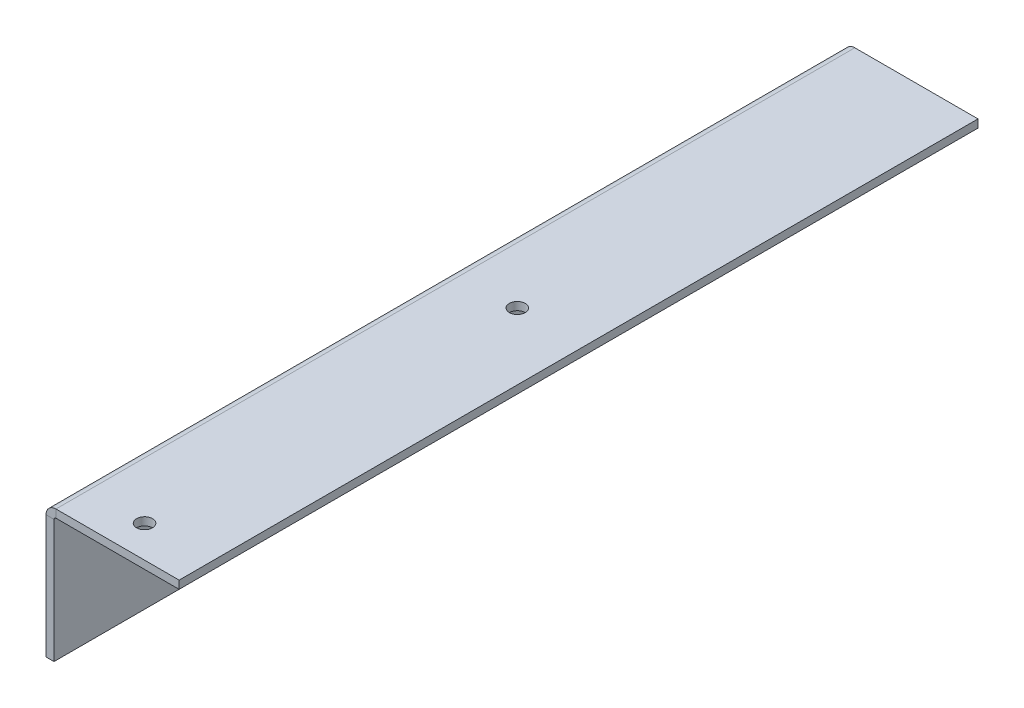
ISO-10303-21;
HEADER;
FILE_DESCRIPTION(('STEP AP214'),'2;1');
FILE_NAME('part.step','',(''),(''),'','','');
FILE_SCHEMA(('AUTOMOTIVE_DESIGN { 1 0 10303 214 1 1 1 1 }'));
ENDSEC;
DATA;
#1=APPLICATION_CONTEXT('core data for automotive mechanical design processes');
#2=APPLICATION_PROTOCOL_DEFINITION('international standard','automotive_design',2000,#1);
#3=PRODUCT_CONTEXT('',#1,'mechanical');
#4=PRODUCT('Part','Part','',(#3));
#5=PRODUCT_RELATED_PRODUCT_CATEGORY('part','',(#4));
#6=PRODUCT_DEFINITION_FORMATION('','',#4);
#7=PRODUCT_DEFINITION_CONTEXT('part definition',#1,'design');
#8=PRODUCT_DEFINITION('design','',#6,#7);
#9=PRODUCT_DEFINITION_SHAPE('','',#8);
#10=(LENGTH_UNIT() NAMED_UNIT(*) SI_UNIT(.MILLI.,.METRE.));
#11=(NAMED_UNIT(*) PLANE_ANGLE_UNIT() SI_UNIT($,.RADIAN.));
#12=(NAMED_UNIT(*) SI_UNIT($,.STERADIAN.) SOLID_ANGLE_UNIT());
#13=UNCERTAINTY_MEASURE_WITH_UNIT(LENGTH_MEASURE(1.E-05),#10,'distance_accuracy_value','');
#14=(GEOMETRIC_REPRESENTATION_CONTEXT(3) GLOBAL_UNCERTAINTY_ASSIGNED_CONTEXT((#13)) GLOBAL_UNIT_ASSIGNED_CONTEXT((#10,
#11,#12)) REPRESENTATION_CONTEXT('',''));
#15=CARTESIAN_POINT('',(0.,0.,0.));
#16=DIRECTION('',(0.,0.,1.));
#17=DIRECTION('',(1.,0.,0.));
#18=AXIS2_PLACEMENT_3D('',#15,#16,#17);
#19=CARTESIAN_POINT('',(3.7366,50.,300.));
#20=DIRECTION('',(0.,0.,1.));
#21=DIRECTION('',(1.,0.,0.));
#22=AXIS2_PLACEMENT_3D('',#19,#20,#21);
#23=PLANE('',#22);
#24=DIRECTION('',(0.,-1.,0.));
#25=VECTOR('',#24,1.);
#26=CARTESIAN_POINT('',(3.7366,50.,300.));
#27=LINE('',#26,#25);
#28=CARTESIAN_POINT('',(3.7366,50.,300.));
#29=VERTEX_POINT('',#28);
#30=CARTESIAN_POINT('',(3.7366,47.,300.));
#31=VERTEX_POINT('',#30);
#32=EDGE_CURVE('E11',#29,#31,#27,.T.);
#33=ORIENTED_EDGE('',*,*,#32,.F.);
#34=CARTESIAN_POINT('',(3.7366,46.2634,300.));
#35=DIRECTION('',(0.,0.,1.));
#36=DIRECTION('',(1.,0.,0.));
#37=AXIS2_PLACEMENT_3D('',#34,#35,#36);
#38=CIRCLE('',#37,3.7366);
#39=CARTESIAN_POINT('',(0.,46.2634,300.));
#40=VERTEX_POINT('',#39);
#41=EDGE_CURVE('E138',#40,#29,#38,.F.);
#42=ORIENTED_EDGE('',*,*,#41,.F.);
#43=DIRECTION('',(-1.,0.,0.));
#44=VECTOR('',#43,1.);
#45=CARTESIAN_POINT('',(3.,46.2634,300.));
#46=LINE('',#45,#44);
#47=CARTESIAN_POINT('',(3.,46.2634,300.));
#48=VERTEX_POINT('',#47);
#49=EDGE_CURVE('E49',#48,#40,#46,.T.);
#50=ORIENTED_EDGE('',*,*,#49,.F.);
#51=CARTESIAN_POINT('',(3.7366,46.2634,300.));
#52=DIRECTION('',(0.,0.,1.));
#53=DIRECTION('',(1.,0.,0.));
#54=AXIS2_PLACEMENT_3D('',#51,#52,#53);
#55=CIRCLE('',#54,0.7366);
#56=EDGE_CURVE('E131',#48,#31,#55,.F.);
#57=ORIENTED_EDGE('',*,*,#56,.T.);
#58=EDGE_LOOP('',(#33,#42,#50,#57));
#59=FACE_BOUND('',#58,.T.);
#60=ADVANCED_FACE('F41',(#59),#23,.T.);
#61=CARTESIAN_POINT('',(3.,46.2634,300.));
#62=DIRECTION('',(0.,0.,1.));
#63=DIRECTION('',(1.,0.,0.));
#64=AXIS2_PLACEMENT_3D('',#61,#62,#63);
#65=PLANE('',#64);
#66=DIRECTION('',(1.,0.,0.));
#67=VECTOR('',#66,1.);
#68=CARTESIAN_POINT('',(0.,50.,300.));
#69=LINE('',#68,#67);
#70=CARTESIAN_POINT('',(50.,50.,300.));
#71=VERTEX_POINT('',#70);
#72=EDGE_CURVE('E188',#29,#71,#69,.T.);
#73=ORIENTED_EDGE('',*,*,#72,.F.);
#74=ORIENTED_EDGE('',*,*,#32,.T.);
#75=DIRECTION('',(1.,0.,0.));
#76=VECTOR('',#75,1.);
#77=CARTESIAN_POINT('',(0.,47.,300.));
#78=LINE('',#77,#76);
#79=CARTESIAN_POINT('',(50.,47.,300.));
#80=VERTEX_POINT('',#79);
#81=EDGE_CURVE('E97',#31,#80,#78,.T.);
#82=ORIENTED_EDGE('',*,*,#81,.T.);
#83=DIRECTION('',(0.,-1.,0.));
#84=VECTOR('',#83,1.);
#85=CARTESIAN_POINT('',(50.,50.,300.));
#86=LINE('',#85,#84);
#87=EDGE_CURVE('E379',#71,#80,#86,.T.);
#88=ORIENTED_EDGE('',*,*,#87,.F.);
#89=EDGE_LOOP('',(#73,#74,#82,#88));
#90=FACE_BOUND('',#89,.T.);
#91=ADVANCED_FACE('F196',(#90),#65,.T.);
#92=CARTESIAN_POINT('',(0.,46.2634,0.));
#93=DIRECTION('',(0.,0.,-1.));
#94=DIRECTION('',(-1.,0.,0.));
#95=AXIS2_PLACEMENT_3D('',#92,#93,#94);
#96=PLANE('',#95);
#97=DIRECTION('',(1.,0.,0.));
#98=VECTOR('',#97,1.);
#99=CARTESIAN_POINT('',(0.,46.2634,0.));
#100=LINE('',#99,#98);
#101=CARTESIAN_POINT('',(0.,46.2634,0.));
#102=VERTEX_POINT('',#101);
#103=CARTESIAN_POINT('',(3.,46.2634,0.));
#104=VERTEX_POINT('',#103);
#105=EDGE_CURVE('E84',#102,#104,#100,.T.);
#106=ORIENTED_EDGE('',*,*,#105,.F.);
#107=CARTESIAN_POINT('',(3.7366,46.2634,0.));
#108=DIRECTION('',(0.,0.,1.));
#109=DIRECTION('',(1.,0.,0.));
#110=AXIS2_PLACEMENT_3D('',#107,#108,#109);
#111=CIRCLE('',#110,3.7366);
#112=CARTESIAN_POINT('',(3.7366,50.,0.));
#113=VERTEX_POINT('',#112);
#114=EDGE_CURVE('E154',#102,#113,#111,.F.);
#115=ORIENTED_EDGE('',*,*,#114,.T.);
#116=DIRECTION('',(0.,1.,0.));
#117=VECTOR('',#116,1.);
#118=CARTESIAN_POINT('',(3.7366,47.,0.));
#119=LINE('',#118,#117);
#120=CARTESIAN_POINT('',(3.7366,47.,0.));
#121=VERTEX_POINT('',#120);
#122=EDGE_CURVE('E91',#121,#113,#119,.T.);
#123=ORIENTED_EDGE('',*,*,#122,.F.);
#124=CARTESIAN_POINT('',(3.7366,46.2634,0.));
#125=DIRECTION('',(0.,0.,1.));
#126=DIRECTION('',(1.,0.,0.));
#127=AXIS2_PLACEMENT_3D('',#124,#125,#126);
#128=CIRCLE('',#127,0.7366);
#129=EDGE_CURVE('E161',#104,#121,#128,.F.);
#130=ORIENTED_EDGE('',*,*,#129,.F.);
#131=EDGE_LOOP('',(#106,#115,#123,#130));
#132=FACE_BOUND('',#131,.T.);
#133=ADVANCED_FACE('F194',(#132),#96,.T.);
#134=CARTESIAN_POINT('',(3.7366,47.,0.));
#135=DIRECTION('',(0.,0.,-1.));
#136=DIRECTION('',(-1.,0.,0.));
#137=AXIS2_PLACEMENT_3D('',#134,#135,#136);
#138=PLANE('',#137);
#139=DIRECTION('',(0.,1.,0.));
#140=VECTOR('',#139,1.);
#141=CARTESIAN_POINT('',(0.,0.,0.));
#142=LINE('',#141,#140);
#143=CARTESIAN_POINT('',(0.,0.,0.));
#144=VERTEX_POINT('',#143);
#145=EDGE_CURVE('E156',#144,#102,#142,.T.);
#146=ORIENTED_EDGE('',*,*,#145,.T.);
#147=ORIENTED_EDGE('',*,*,#105,.T.);
#148=DIRECTION('',(0.,1.,0.));
#149=VECTOR('',#148,1.);
#150=CARTESIAN_POINT('',(3.,0.,0.));
#151=LINE('',#150,#149);
#152=CARTESIAN_POINT('',(3.,0.,0.));
#153=VERTEX_POINT('',#152);
#154=EDGE_CURVE('E159',#153,#104,#151,.T.);
#155=ORIENTED_EDGE('',*,*,#154,.F.);
#156=DIRECTION('',(-1.,0.,0.));
#157=VECTOR('',#156,1.);
#158=CARTESIAN_POINT('',(3.,0.,0.));
#159=LINE('',#158,#157);
#160=EDGE_CURVE('E119',#153,#144,#159,.T.);
#161=ORIENTED_EDGE('',*,*,#160,.T.);
#162=EDGE_LOOP('',(#146,#147,#155,#161));
#163=FACE_BOUND('',#162,.T.);
#164=ADVANCED_FACE('F190',(#163),#138,.T.);
#165=CARTESIAN_POINT('',(0.,47.,300.));
#166=DIRECTION('',(0.,1.,0.));
#167=DIRECTION('',(0.,0.,1.));
#168=AXIS2_PLACEMENT_3D('',#165,#166,#167);
#169=PLANE('',#168);
#170=CARTESIAN_POINT('',(25.,47.,288.));
#171=DIRECTION('',(0.,1.,0.));
#172=DIRECTION('',(0.,0.,1.));
#173=AXIS2_PLACEMENT_3D('',#170,#171,#172);
#174=CIRCLE('',#173,3.);
#175=CARTESIAN_POINT('',(25.,47.,291.));
#176=VERTEX_POINT('',#175);
#177=EDGE_CURVE('E148',#176,#176,#174,.T.);
#178=ORIENTED_EDGE('',*,*,#177,.T.);
#179=EDGE_LOOP('',(#178));
#180=FACE_BOUND('',#179,.T.);
#181=CARTESIAN_POINT('',(25.,47.,148.));
#182=DIRECTION('',(0.,1.,0.));
#183=DIRECTION('',(0.,0.,1.));
#184=AXIS2_PLACEMENT_3D('',#181,#182,#183);
#185=CIRCLE('',#184,3.);
#186=CARTESIAN_POINT('',(25.,47.,151.));
#187=VERTEX_POINT('',#186);
#188=EDGE_CURVE('E372',#187,#187,#185,.T.);
#189=ORIENTED_EDGE('',*,*,#188,.T.);
#190=EDGE_LOOP('',(#189));
#191=FACE_BOUND('',#190,.T.);
#192=DIRECTION('',(1.,0.,0.));
#193=VECTOR('',#192,1.);
#194=CARTESIAN_POINT('',(0.,47.,0.));
#195=LINE('',#194,#193);
#196=CARTESIAN_POINT('',(50.,47.,0.));
#197=VERTEX_POINT('',#196);
#198=EDGE_CURVE('E144',#121,#197,#195,.T.);
#199=ORIENTED_EDGE('',*,*,#198,.T.);
#200=DIRECTION('',(0.,0.,-1.));
#201=VECTOR('',#200,1.);
#202=CARTESIAN_POINT('',(50.,47.,300.));
#203=LINE('',#202,#201);
#204=EDGE_CURVE('E175',#80,#197,#203,.T.);
#205=ORIENTED_EDGE('',*,*,#204,.F.);
#206=ORIENTED_EDGE('',*,*,#81,.F.);
#207=DIRECTION('',(0.,0.,-1.));
#208=VECTOR('',#207,1.);
#209=CARTESIAN_POINT('',(3.7366,47.,300.));
#210=LINE('',#209,#208);
#211=EDGE_CURVE('E143',#31,#121,#210,.T.);
#212=ORIENTED_EDGE('',*,*,#211,.T.);
#213=EDGE_LOOP('',(#199,#205,#206,#212));
#214=FACE_BOUND('',#213,.T.);
#215=ADVANCED_FACE('F202',(#180,#191,#214),#169,.F.);
#216=CARTESIAN_POINT('',(50.,50.,300.));
#217=DIRECTION('',(1.,0.,0.));
#218=DIRECTION('',(0.,0.,-1.));
#219=AXIS2_PLACEMENT_3D('',#216,#217,#218);
#220=PLANE('',#219);
#221=DIRECTION('',(0.,-1.,0.));
#222=VECTOR('',#221,1.);
#223=CARTESIAN_POINT('',(50.,50.,0.));
#224=LINE('',#223,#222);
#225=CARTESIAN_POINT('',(50.,50.,0.));
#226=VERTEX_POINT('',#225);
#227=EDGE_CURVE('E147',#226,#197,#224,.T.);
#228=ORIENTED_EDGE('',*,*,#227,.F.);
#229=DIRECTION('',(0.,0.,-1.));
#230=VECTOR('',#229,1.);
#231=CARTESIAN_POINT('',(50.,50.,300.));
#232=LINE('',#231,#230);
#233=EDGE_CURVE('E173',#71,#226,#232,.T.);
#234=ORIENTED_EDGE('',*,*,#233,.F.);
#235=ORIENTED_EDGE('',*,*,#87,.T.);
#236=ORIENTED_EDGE('',*,*,#204,.T.);
#237=EDGE_LOOP('',(#228,#234,#235,#236));
#238=FACE_BOUND('',#237,.T.);
#239=ADVANCED_FACE('F231',(#238),#220,.T.);
#240=CARTESIAN_POINT('',(0.,50.,300.));
#241=DIRECTION('',(0.,1.,0.));
#242=DIRECTION('',(0.,0.,1.));
#243=AXIS2_PLACEMENT_3D('',#240,#241,#242);
#244=PLANE('',#243);
#245=CARTESIAN_POINT('',(25.,50.,288.));
#246=DIRECTION('',(0.,1.,0.));
#247=DIRECTION('',(0.,0.,1.));
#248=AXIS2_PLACEMENT_3D('',#245,#246,#247);
#249=CIRCLE('',#248,3.);
#250=CARTESIAN_POINT('',(25.,50.,291.));
#251=VERTEX_POINT('',#250);
#252=EDGE_CURVE('E369',#251,#251,#249,.T.);
#253=ORIENTED_EDGE('',*,*,#252,.F.);
#254=EDGE_LOOP('',(#253));
#255=FACE_BOUND('',#254,.T.);
#256=CARTESIAN_POINT('',(25.,50.,148.));
#257=DIRECTION('',(0.,1.,0.));
#258=DIRECTION('',(0.,0.,1.));
#259=AXIS2_PLACEMENT_3D('',#256,#257,#258);
#260=CIRCLE('',#259,3.);
#261=CARTESIAN_POINT('',(25.,50.,151.));
#262=VERTEX_POINT('',#261);
#263=EDGE_CURVE('E388',#262,#262,#260,.T.);
#264=ORIENTED_EDGE('',*,*,#263,.F.);
#265=EDGE_LOOP('',(#264));
#266=FACE_BOUND('',#265,.T.);
#267=DIRECTION('',(1.,0.,0.));
#268=VECTOR('',#267,1.);
#269=CARTESIAN_POINT('',(0.,50.,0.));
#270=LINE('',#269,#268);
#271=EDGE_CURVE('E151',#113,#226,#270,.T.);
#272=ORIENTED_EDGE('',*,*,#271,.F.);
#273=DIRECTION('',(0.,0.,-1.));
#274=VECTOR('',#273,1.);
#275=CARTESIAN_POINT('',(3.7366,50.,300.));
#276=LINE('',#275,#274);
#277=EDGE_CURVE('E170',#29,#113,#276,.T.);
#278=ORIENTED_EDGE('',*,*,#277,.F.);
#279=ORIENTED_EDGE('',*,*,#72,.T.);
#280=ORIENTED_EDGE('',*,*,#233,.T.);
#281=EDGE_LOOP('',(#272,#278,#279,#280));
#282=FACE_BOUND('',#281,.T.);
#283=ADVANCED_FACE('F236',(#255,#266,#282),#244,.T.);
#284=CARTESIAN_POINT('',(3.7366,46.2634,300.));
#285=DIRECTION('',(0.,0.,-1.));
#286=DIRECTION('',(-1.,0.,0.));
#287=AXIS2_PLACEMENT_3D('',#284,#285,#286);
#288=CYLINDRICAL_SURFACE('',#287,3.7366);
#289=ORIENTED_EDGE('',*,*,#114,.F.);
#290=DIRECTION('',(0.,0.,-1.));
#291=VECTOR('',#290,1.);
#292=CARTESIAN_POINT('',(0.,46.2634,300.));
#293=LINE('',#292,#291);
#294=EDGE_CURVE('E167',#40,#102,#293,.T.);
#295=ORIENTED_EDGE('',*,*,#294,.F.);
#296=ORIENTED_EDGE('',*,*,#41,.T.);
#297=ORIENTED_EDGE('',*,*,#277,.T.);
#298=EDGE_LOOP('',(#289,#295,#296,#297));
#299=FACE_BOUND('',#298,.T.);
#300=ADVANCED_FACE('F184',(#299),#288,.T.);
#301=CARTESIAN_POINT('',(0.,0.,300.));
#302=DIRECTION('',(-1.,0.,0.));
#303=DIRECTION('',(0.,0.,1.));
#304=AXIS2_PLACEMENT_3D('',#301,#302,#303);
#305=PLANE('',#304);
#306=ORIENTED_EDGE('',*,*,#145,.F.);
#307=DIRECTION('',(0.,0.,-1.));
#308=VECTOR('',#307,1.);
#309=CARTESIAN_POINT('',(0.,0.,300.));
#310=LINE('',#309,#308);
#311=CARTESIAN_POINT('',(0.,0.,300.));
#312=VERTEX_POINT('',#311);
#313=EDGE_CURVE('E121',#312,#144,#310,.T.);
#314=ORIENTED_EDGE('',*,*,#313,.F.);
#315=DIRECTION('',(0.,1.,0.));
#316=VECTOR('',#315,1.);
#317=CARTESIAN_POINT('',(0.,0.,300.));
#318=LINE('',#317,#316);
#319=EDGE_CURVE('E136',#312,#40,#318,.T.);
#320=ORIENTED_EDGE('',*,*,#319,.T.);
#321=ORIENTED_EDGE('',*,*,#294,.T.);
#322=EDGE_LOOP('',(#306,#314,#320,#321));
#323=FACE_BOUND('',#322,.T.);
#324=ADVANCED_FACE('F189',(#323),#305,.T.);
#325=CARTESIAN_POINT('',(3.,0.,300.));
#326=DIRECTION('',(0.,-1.,0.));
#327=DIRECTION('',(0.,0.,-1.));
#328=AXIS2_PLACEMENT_3D('',#325,#326,#327);
#329=PLANE('',#328);
#330=ORIENTED_EDGE('',*,*,#160,.F.);
#331=DIRECTION('',(0.,0.,-1.));
#332=VECTOR('',#331,1.);
#333=CARTESIAN_POINT('',(3.,0.,300.));
#334=LINE('',#333,#332);
#335=CARTESIAN_POINT('',(3.,0.,300.));
#336=VERTEX_POINT('',#335);
#337=EDGE_CURVE('E113',#336,#153,#334,.T.);
#338=ORIENTED_EDGE('',*,*,#337,.F.);
#339=DIRECTION('',(-1.,0.,0.));
#340=VECTOR('',#339,1.);
#341=CARTESIAN_POINT('',(3.,0.,300.));
#342=LINE('',#341,#340);
#343=EDGE_CURVE('E117',#336,#312,#342,.T.);
#344=ORIENTED_EDGE('',*,*,#343,.T.);
#345=ORIENTED_EDGE('',*,*,#313,.T.);
#346=EDGE_LOOP('',(#330,#338,#344,#345));
#347=FACE_BOUND('',#346,.T.);
#348=ADVANCED_FACE('F115',(#347),#329,.T.);
#349=CARTESIAN_POINT('',(3.,0.,300.));
#350=DIRECTION('',(-1.,0.,0.));
#351=DIRECTION('',(0.,0.,1.));
#352=AXIS2_PLACEMENT_3D('',#349,#350,#351);
#353=PLANE('',#352);
#354=ORIENTED_EDGE('',*,*,#154,.T.);
#355=DIRECTION('',(0.,0.,-1.));
#356=VECTOR('',#355,1.);
#357=CARTESIAN_POINT('',(3.,46.2634,300.));
#358=LINE('',#357,#356);
#359=EDGE_CURVE('E122',#48,#104,#358,.T.);
#360=ORIENTED_EDGE('',*,*,#359,.F.);
#361=DIRECTION('',(0.,1.,0.));
#362=VECTOR('',#361,1.);
#363=CARTESIAN_POINT('',(3.,0.,300.));
#364=LINE('',#363,#362);
#365=EDGE_CURVE('E126',#336,#48,#364,.T.);
#366=ORIENTED_EDGE('',*,*,#365,.F.);
#367=ORIENTED_EDGE('',*,*,#337,.T.);
#368=EDGE_LOOP('',(#354,#360,#366,#367));
#369=FACE_BOUND('',#368,.T.);
#370=ADVANCED_FACE('F127',(#369),#353,.F.);
#371=CARTESIAN_POINT('',(3.7366,46.2634,300.));
#372=DIRECTION('',(0.,0.,-1.));
#373=DIRECTION('',(-1.,0.,0.));
#374=AXIS2_PLACEMENT_3D('',#371,#372,#373);
#375=CYLINDRICAL_SURFACE('',#374,0.7366);
#376=ORIENTED_EDGE('',*,*,#129,.T.);
#377=ORIENTED_EDGE('',*,*,#211,.F.);
#378=ORIENTED_EDGE('',*,*,#56,.F.);
#379=ORIENTED_EDGE('',*,*,#359,.T.);
#380=EDGE_LOOP('',(#376,#377,#378,#379));
#381=FACE_BOUND('',#380,.T.);
#382=ADVANCED_FACE('F192',(#381),#375,.F.);
#383=CARTESIAN_POINT('',(3.7366,46.2634,300.));
#384=DIRECTION('',(0.,0.,1.));
#385=DIRECTION('',(1.,0.,0.));
#386=AXIS2_PLACEMENT_3D('',#383,#384,#385);
#387=PLANE('',#386);
#388=ORIENTED_EDGE('',*,*,#365,.T.);
#389=ORIENTED_EDGE('',*,*,#49,.T.);
#390=ORIENTED_EDGE('',*,*,#319,.F.);
#391=ORIENTED_EDGE('',*,*,#343,.F.);
#392=EDGE_LOOP('',(#388,#389,#390,#391));
#393=FACE_BOUND('',#392,.T.);
#394=ADVANCED_FACE('F134',(#393),#387,.T.);
#395=CARTESIAN_POINT('',(3.7366,46.2634,0.));
#396=DIRECTION('',(0.,0.,1.));
#397=DIRECTION('',(1.,0.,0.));
#398=AXIS2_PLACEMENT_3D('',#395,#396,#397);
#399=PLANE('',#398);
#400=ORIENTED_EDGE('',*,*,#198,.F.);
#401=ORIENTED_EDGE('',*,*,#122,.T.);
#402=ORIENTED_EDGE('',*,*,#271,.T.);
#403=ORIENTED_EDGE('',*,*,#227,.T.);
#404=EDGE_LOOP('',(#400,#401,#402,#403));
#405=FACE_BOUND('',#404,.T.);
#406=ADVANCED_FACE('F294',(#405),#399,.F.);
#407=CARTESIAN_POINT('',(25.,40.,148.));
#408=DIRECTION('',(0.,1.,0.));
#409=DIRECTION('',(0.,0.,1.));
#410=AXIS2_PLACEMENT_3D('',#407,#408,#409);
#411=CYLINDRICAL_SURFACE('',#410,3.);
#412=ORIENTED_EDGE('',*,*,#263,.T.);
#413=EDGE_LOOP('',(#412));
#414=FACE_BOUND('',#413,.T.);
#415=ORIENTED_EDGE('',*,*,#188,.F.);
#416=EDGE_LOOP('',(#415));
#417=FACE_BOUND('',#416,.T.);
#418=ADVANCED_FACE('F304',(#414,#417),#411,.F.);
#419=CARTESIAN_POINT('',(25.,40.,288.));
#420=DIRECTION('',(0.,1.,0.));
#421=DIRECTION('',(0.,0.,1.));
#422=AXIS2_PLACEMENT_3D('',#419,#420,#421);
#423=CYLINDRICAL_SURFACE('',#422,3.);
#424=ORIENTED_EDGE('',*,*,#252,.T.);
#425=EDGE_LOOP('',(#424));
#426=FACE_BOUND('',#425,.T.);
#427=ORIENTED_EDGE('',*,*,#177,.F.);
#428=EDGE_LOOP('',(#427));
#429=FACE_BOUND('',#428,.T.);
#430=ADVANCED_FACE('F331',(#426,#429),#423,.F.);
#431=CLOSED_SHELL('',(#60,#91,#133,#164,#215,#239,#283,#300,#324,#348,#370,#382,#394,#406,#418,#430));
#432=MANIFOLD_SOLID_BREP('B2',#431);
#433=ADVANCED_BREP_SHAPE_REPRESENTATION('',(#18,#432),#14);
#434=SHAPE_DEFINITION_REPRESENTATION(#9,#433);
ENDSEC;
END-ISO-10303-21;
